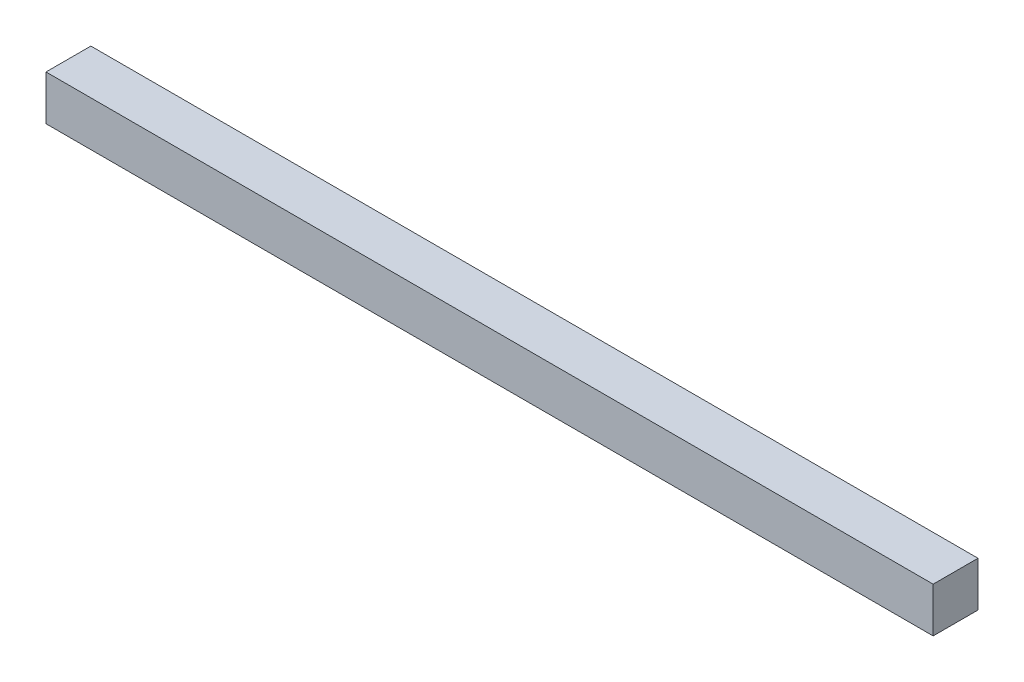
ISO-10303-21;
HEADER;
FILE_DESCRIPTION(('STEP AP214'),'2;1');
FILE_NAME('part.step','',(''),(''),'','','');
FILE_SCHEMA(('AUTOMOTIVE_DESIGN { 1 0 10303 214 1 1 1 1 }'));
ENDSEC;
DATA;
#1=APPLICATION_CONTEXT('core data for automotive mechanical design processes');
#2=APPLICATION_PROTOCOL_DEFINITION('international standard','automotive_design',2000,#1);
#3=PRODUCT_CONTEXT('',#1,'mechanical');
#4=PRODUCT('Part','Part','',(#3));
#5=PRODUCT_RELATED_PRODUCT_CATEGORY('part','',(#4));
#6=PRODUCT_DEFINITION_FORMATION('','',#4);
#7=PRODUCT_DEFINITION_CONTEXT('part definition',#1,'design');
#8=PRODUCT_DEFINITION('design','',#6,#7);
#9=PRODUCT_DEFINITION_SHAPE('','',#8);
#10=(LENGTH_UNIT() NAMED_UNIT(*) SI_UNIT(.MILLI.,.METRE.));
#11=(NAMED_UNIT(*) PLANE_ANGLE_UNIT() SI_UNIT($,.RADIAN.));
#12=(NAMED_UNIT(*) SI_UNIT($,.STERADIAN.) SOLID_ANGLE_UNIT());
#13=UNCERTAINTY_MEASURE_WITH_UNIT(LENGTH_MEASURE(1.E-05),#10,'distance_accuracy_value','');
#14=(GEOMETRIC_REPRESENTATION_CONTEXT(3) GLOBAL_UNCERTAINTY_ASSIGNED_CONTEXT((#13)) GLOBAL_UNIT_ASSIGNED_CONTEXT((#10,
#11,#12)) REPRESENTATION_CONTEXT('',''));
#15=CARTESIAN_POINT('',(0.,0.,0.));
#16=DIRECTION('',(0.,0.,1.));
#17=DIRECTION('',(1.,0.,0.));
#18=AXIS2_PLACEMENT_3D('',#15,#16,#17);
#19=CARTESIAN_POINT('',(89.,-4.5,-4.5));
#20=DIRECTION('',(0.,0.,1.));
#21=DIRECTION('',(1.,0.,0.));
#22=AXIS2_PLACEMENT_3D('',#19,#20,#21);
#23=PLANE('',#22);
#24=DIRECTION('',(-1.,0.,0.));
#25=VECTOR('',#24,1.);
#26=CARTESIAN_POINT('',(89.,-4.5,-4.5));
#27=LINE('',#26,#25);
#28=CARTESIAN_POINT('',(89.,-4.5,-4.5));
#29=VERTEX_POINT('',#28);
#30=CARTESIAN_POINT('',(-89.,-4.5,-4.5));
#31=VERTEX_POINT('',#30);
#32=EDGE_CURVE('E90',#29,#31,#27,.T.);
#33=ORIENTED_EDGE('',*,*,#32,.T.);
#34=DIRECTION('',(0.,1.,0.));
#35=VECTOR('',#34,1.);
#36=CARTESIAN_POINT('',(-89.,-4.5,-4.5));
#37=LINE('',#36,#35);
#38=CARTESIAN_POINT('',(-89.,4.5,-4.5));
#39=VERTEX_POINT('',#38);
#40=EDGE_CURVE('E85',#31,#39,#37,.T.);
#41=ORIENTED_EDGE('',*,*,#40,.T.);
#42=DIRECTION('',(-1.,0.,0.));
#43=VECTOR('',#42,1.);
#44=CARTESIAN_POINT('',(89.,4.5,-4.5));
#45=LINE('',#44,#43);
#46=CARTESIAN_POINT('',(89.,4.5,-4.5));
#47=VERTEX_POINT('',#46);
#48=EDGE_CURVE('E11',#47,#39,#45,.T.);
#49=ORIENTED_EDGE('',*,*,#48,.F.);
#50=DIRECTION('',(0.,1.,0.));
#51=VECTOR('',#50,1.);
#52=CARTESIAN_POINT('',(89.,-4.5,-4.5));
#53=LINE('',#52,#51);
#54=EDGE_CURVE('E96',#29,#47,#53,.T.);
#55=ORIENTED_EDGE('',*,*,#54,.F.);
#56=EDGE_LOOP('',(#33,#41,#49,#55));
#57=FACE_BOUND('',#56,.T.);
#58=ADVANCED_FACE('F33',(#57),#23,.F.);
#59=CARTESIAN_POINT('',(89.,4.5,4.5));
#60=DIRECTION('',(0.,-1.,0.));
#61=DIRECTION('',(0.,0.,-1.));
#62=AXIS2_PLACEMENT_3D('',#59,#60,#61);
#63=PLANE('',#62);
#64=ORIENTED_EDGE('',*,*,#48,.T.);
#65=DIRECTION('',(0.,0.,1.));
#66=VECTOR('',#65,1.);
#67=CARTESIAN_POINT('',(-89.,4.5,4.5));
#68=LINE('',#67,#66);
#69=CARTESIAN_POINT('',(-89.,4.5,4.5));
#70=VERTEX_POINT('',#69);
#71=EDGE_CURVE('E75',#39,#70,#68,.T.);
#72=ORIENTED_EDGE('',*,*,#71,.T.);
#73=DIRECTION('',(-1.,0.,0.));
#74=VECTOR('',#73,1.);
#75=CARTESIAN_POINT('',(89.,4.5,4.5));
#76=LINE('',#75,#74);
#77=CARTESIAN_POINT('',(89.,4.5,4.5));
#78=VERTEX_POINT('',#77);
#79=EDGE_CURVE('E40',#78,#70,#76,.T.);
#80=ORIENTED_EDGE('',*,*,#79,.F.);
#81=DIRECTION('',(0.,0.,1.));
#82=VECTOR('',#81,1.);
#83=CARTESIAN_POINT('',(89.,4.5,4.5));
#84=LINE('',#83,#82);
#85=EDGE_CURVE('E76',#47,#78,#84,.T.);
#86=ORIENTED_EDGE('',*,*,#85,.F.);
#87=EDGE_LOOP('',(#64,#72,#80,#86));
#88=FACE_BOUND('',#87,.T.);
#89=ADVANCED_FACE('F73',(#88),#63,.F.);
#90=CARTESIAN_POINT('',(89.,-4.5,4.5));
#91=DIRECTION('',(0.,0.,-1.));
#92=DIRECTION('',(-1.,0.,0.));
#93=AXIS2_PLACEMENT_3D('',#90,#91,#92);
#94=PLANE('',#93);
#95=ORIENTED_EDGE('',*,*,#79,.T.);
#96=DIRECTION('',(0.,-1.,0.));
#97=VECTOR('',#96,1.);
#98=CARTESIAN_POINT('',(-89.,-4.5,4.5));
#99=LINE('',#98,#97);
#100=CARTESIAN_POINT('',(-89.,-4.5,4.5));
#101=VERTEX_POINT('',#100);
#102=EDGE_CURVE('E88',#70,#101,#99,.T.);
#103=ORIENTED_EDGE('',*,*,#102,.T.);
#104=DIRECTION('',(-1.,0.,0.));
#105=VECTOR('',#104,1.);
#106=CARTESIAN_POINT('',(89.,-4.5,4.5));
#107=LINE('',#106,#105);
#108=CARTESIAN_POINT('',(89.,-4.5,4.5));
#109=VERTEX_POINT('',#108);
#110=EDGE_CURVE('E102',#109,#101,#107,.T.);
#111=ORIENTED_EDGE('',*,*,#110,.F.);
#112=DIRECTION('',(0.,-1.,0.));
#113=VECTOR('',#112,1.);
#114=CARTESIAN_POINT('',(89.,-4.5,4.5));
#115=LINE('',#114,#113);
#116=EDGE_CURVE('E52',#78,#109,#115,.T.);
#117=ORIENTED_EDGE('',*,*,#116,.F.);
#118=EDGE_LOOP('',(#95,#103,#111,#117));
#119=FACE_BOUND('',#118,.T.);
#120=ADVANCED_FACE('F104',(#119),#94,.F.);
#121=CARTESIAN_POINT('',(89.,-4.5,4.5));
#122=DIRECTION('',(0.,1.,0.));
#123=DIRECTION('',(0.,0.,1.));
#124=AXIS2_PLACEMENT_3D('',#121,#122,#123);
#125=PLANE('',#124);
#126=ORIENTED_EDGE('',*,*,#110,.T.);
#127=DIRECTION('',(0.,0.,-1.));
#128=VECTOR('',#127,1.);
#129=CARTESIAN_POINT('',(-89.,-4.5,4.5));
#130=LINE('',#129,#128);
#131=EDGE_CURVE('E94',#101,#31,#130,.T.);
#132=ORIENTED_EDGE('',*,*,#131,.T.);
#133=ORIENTED_EDGE('',*,*,#32,.F.);
#134=DIRECTION('',(0.,0.,-1.));
#135=VECTOR('',#134,1.);
#136=CARTESIAN_POINT('',(89.,-4.5,4.5));
#137=LINE('',#136,#135);
#138=EDGE_CURVE('E47',#109,#29,#137,.T.);
#139=ORIENTED_EDGE('',*,*,#138,.F.);
#140=EDGE_LOOP('',(#126,#132,#133,#139));
#141=FACE_BOUND('',#140,.T.);
#142=ADVANCED_FACE('F106',(#141),#125,.F.);
#143=CARTESIAN_POINT('',(89.,0.,0.));
#144=DIRECTION('',(-1.,0.,0.));
#145=DIRECTION('',(0.,0.,1.));
#146=AXIS2_PLACEMENT_3D('',#143,#144,#145);
#147=PLANE('',#146);
#148=ORIENTED_EDGE('',*,*,#54,.T.);
#149=ORIENTED_EDGE('',*,*,#85,.T.);
#150=ORIENTED_EDGE('',*,*,#116,.T.);
#151=ORIENTED_EDGE('',*,*,#138,.T.);
#152=EDGE_LOOP('',(#148,#149,#150,#151));
#153=FACE_BOUND('',#152,.T.);
#154=ADVANCED_FACE('F107',(#153),#147,.F.);
#155=CARTESIAN_POINT('',(-89.,0.,0.));
#156=DIRECTION('',(-1.,0.,0.));
#157=DIRECTION('',(0.,0.,1.));
#158=AXIS2_PLACEMENT_3D('',#155,#156,#157);
#159=PLANE('',#158);
#160=ORIENTED_EDGE('',*,*,#40,.F.);
#161=ORIENTED_EDGE('',*,*,#131,.F.);
#162=ORIENTED_EDGE('',*,*,#102,.F.);
#163=ORIENTED_EDGE('',*,*,#71,.F.);
#164=EDGE_LOOP('',(#160,#161,#162,#163));
#165=FACE_BOUND('',#164,.T.);
#166=ADVANCED_FACE('F83',(#165),#159,.T.);
#167=CLOSED_SHELL('',(#58,#89,#120,#142,#154,#166));
#168=MANIFOLD_SOLID_BREP('B2',#167);
#169=ADVANCED_BREP_SHAPE_REPRESENTATION('',(#18,#168),#14);
#170=SHAPE_DEFINITION_REPRESENTATION(#9,#169);
ENDSEC;
END-ISO-10303-21;
